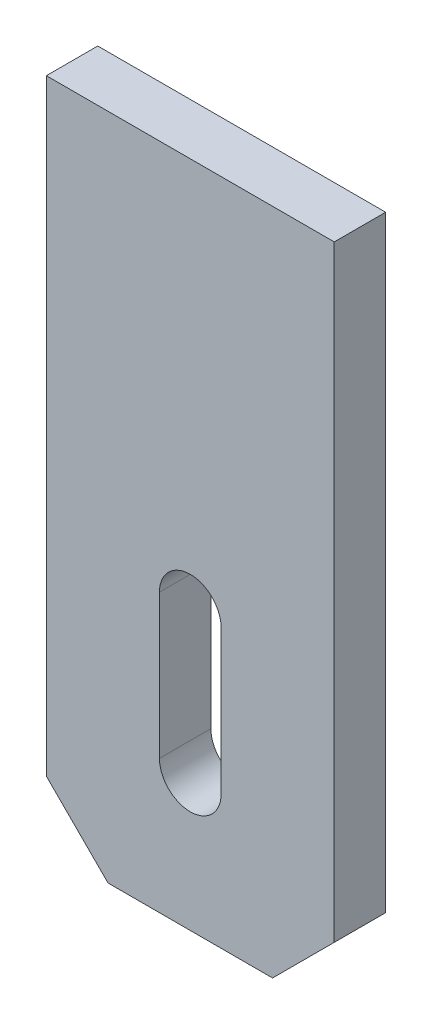
ISO-10303-21;
HEADER;
FILE_DESCRIPTION(('STEP AP214'),'2;1');
FILE_NAME('part.step','',(''),(''),'','','');
FILE_SCHEMA(('AUTOMOTIVE_DESIGN { 1 0 10303 214 1 1 1 1 }'));
ENDSEC;
DATA;
#1=APPLICATION_CONTEXT('core data for automotive mechanical design processes');
#2=APPLICATION_PROTOCOL_DEFINITION('international standard','automotive_design',2000,#1);
#3=PRODUCT_CONTEXT('',#1,'mechanical');
#4=PRODUCT('Part','Part','',(#3));
#5=PRODUCT_RELATED_PRODUCT_CATEGORY('part','',(#4));
#6=PRODUCT_DEFINITION_FORMATION('','',#4);
#7=PRODUCT_DEFINITION_CONTEXT('part definition',#1,'design');
#8=PRODUCT_DEFINITION('design','',#6,#7);
#9=PRODUCT_DEFINITION_SHAPE('','',#8);
#10=(LENGTH_UNIT() NAMED_UNIT(*) SI_UNIT(.MILLI.,.METRE.));
#11=(NAMED_UNIT(*) PLANE_ANGLE_UNIT() SI_UNIT($,.RADIAN.));
#12=(NAMED_UNIT(*) SI_UNIT($,.STERADIAN.) SOLID_ANGLE_UNIT());
#13=UNCERTAINTY_MEASURE_WITH_UNIT(LENGTH_MEASURE(1.E-05),#10,'distance_accuracy_value','');
#14=(GEOMETRIC_REPRESENTATION_CONTEXT(3) GLOBAL_UNCERTAINTY_ASSIGNED_CONTEXT((#13)) GLOBAL_UNIT_ASSIGNED_CONTEXT((#10,
#11,#12)) REPRESENTATION_CONTEXT('',''));
#15=CARTESIAN_POINT('',(0.,0.,0.));
#16=DIRECTION('',(0.,0.,1.));
#17=DIRECTION('',(1.,0.,0.));
#18=AXIS2_PLACEMENT_3D('',#15,#16,#17);
#19=CARTESIAN_POINT('',(1.4,-32.8,-0.249999999999999));
#20=DIRECTION('',(-1.,0.,0.));
#21=DIRECTION('',(0.,0.,1.));
#22=AXIS2_PLACEMENT_3D('',#19,#20,#21);
#23=PLANE('',#22);
#24=DIRECTION('',(0.,1.,0.));
#25=VECTOR('',#24,1.);
#26=CARTESIAN_POINT('',(1.4,-32.8,0.249999999999999));
#27=LINE('',#26,#25);
#28=CARTESIAN_POINT('',(1.4,-32.2,0.249999999999999));
#29=VERTEX_POINT('',#28);
#30=CARTESIAN_POINT('',(1.4,-26.3,0.249999999999999));
#31=VERTEX_POINT('',#30);
#32=EDGE_CURVE('E35',#29,#31,#27,.T.);
#33=ORIENTED_EDGE('',*,*,#32,.F.);
#34=DIRECTION('',(0.,0.,-1.));
#35=VECTOR('',#34,1.);
#36=CARTESIAN_POINT('',(1.4,-32.2,-0.249999999999999));
#37=LINE('',#36,#35);
#38=CARTESIAN_POINT('',(1.4,-32.2,-0.249999999999999));
#39=VERTEX_POINT('',#38);
#40=EDGE_CURVE('E11',#29,#39,#37,.T.);
#41=ORIENTED_EDGE('',*,*,#40,.T.);
#42=DIRECTION('',(0.,1.,0.));
#43=VECTOR('',#42,1.);
#44=CARTESIAN_POINT('',(1.4,-32.8,-0.249999999999999));
#45=LINE('',#44,#43);
#46=CARTESIAN_POINT('',(1.4,-26.3,-0.249999999999999));
#47=VERTEX_POINT('',#46);
#48=EDGE_CURVE('E27',#39,#47,#45,.T.);
#49=ORIENTED_EDGE('',*,*,#48,.T.);
#50=DIRECTION('',(0.,0.,1.));
#51=VECTOR('',#50,1.);
#52=CARTESIAN_POINT('',(1.4,-26.3,-0.249999999999999));
#53=LINE('',#52,#51);
#54=EDGE_CURVE('E157',#47,#31,#53,.T.);
#55=ORIENTED_EDGE('',*,*,#54,.T.);
#56=EDGE_LOOP('',(#33,#41,#49,#55));
#57=FACE_BOUND('',#56,.T.);
#58=ADVANCED_FACE('F17',(#57),#23,.F.);
#59=CARTESIAN_POINT('',(-1.4,-32.8,0.249999999999999));
#60=DIRECTION('',(0.,0.,-1.));
#61=DIRECTION('',(-1.,0.,0.));
#62=AXIS2_PLACEMENT_3D('',#59,#60,#61);
#63=PLANE('',#62);
#64=DIRECTION('',(0.,1.,0.));
#65=VECTOR('',#64,1.);
#66=CARTESIAN_POINT('',(0.3,-31.5,0.249999999999999));
#67=LINE('',#66,#65);
#68=CARTESIAN_POINT('',(0.3,-31.5,0.249999999999999));
#69=VERTEX_POINT('',#68);
#70=CARTESIAN_POINT('',(0.3,-30.1,0.249999999999999));
#71=VERTEX_POINT('',#70);
#72=EDGE_CURVE('E129',#69,#71,#67,.T.);
#73=ORIENTED_EDGE('',*,*,#72,.F.);
#74=CARTESIAN_POINT('',(0.,-31.5,0.249999999999999));
#75=DIRECTION('',(0.,0.,1.));
#76=DIRECTION('',(1.,0.,0.));
#77=AXIS2_PLACEMENT_3D('',#74,#75,#76);
#78=CIRCLE('',#77,0.3);
#79=CARTESIAN_POINT('',(-0.3,-31.5,0.249999999999999));
#80=VERTEX_POINT('',#79);
#81=EDGE_CURVE('E125',#80,#69,#78,.T.);
#82=ORIENTED_EDGE('',*,*,#81,.F.);
#83=DIRECTION('',(0.,-1.,0.));
#84=VECTOR('',#83,1.);
#85=CARTESIAN_POINT('',(-0.3,-31.5,0.249999999999999));
#86=LINE('',#85,#84);
#87=CARTESIAN_POINT('',(-0.3,-30.1,0.249999999999999));
#88=VERTEX_POINT('',#87);
#89=EDGE_CURVE('E133',#88,#80,#86,.T.);
#90=ORIENTED_EDGE('',*,*,#89,.F.);
#91=CARTESIAN_POINT('',(0.,-30.1,0.249999999999999));
#92=DIRECTION('',(0.,0.,1.));
#93=DIRECTION('',(1.,0.,0.));
#94=AXIS2_PLACEMENT_3D('',#91,#92,#93);
#95=CIRCLE('',#94,0.3);
#96=EDGE_CURVE('E148',#71,#88,#95,.T.);
#97=ORIENTED_EDGE('',*,*,#96,.F.);
#98=EDGE_LOOP('',(#73,#82,#90,#97));
#99=FACE_BOUND('',#98,.T.);
#100=DIRECTION('',(0.,1.,0.));
#101=VECTOR('',#100,1.);
#102=CARTESIAN_POINT('',(-1.4,-32.8,0.249999999999999));
#103=LINE('',#102,#101);
#104=CARTESIAN_POINT('',(-1.4,-32.2,0.249999999999999));
#105=VERTEX_POINT('',#104);
#106=CARTESIAN_POINT('',(-1.4,-26.3,0.249999999999999));
#107=VERTEX_POINT('',#106);
#108=EDGE_CURVE('E150',#105,#107,#103,.T.);
#109=ORIENTED_EDGE('',*,*,#108,.F.);
#110=DIRECTION('',(0.707106781186548,-0.707106781186547,0.));
#111=VECTOR('',#110,1.);
#112=CARTESIAN_POINT('',(-0.799999999999994,-32.8,0.249999999999999));
#113=LINE('',#112,#111);
#114=CARTESIAN_POINT('',(-0.799999999999994,-32.8,0.249999999999999));
#115=VERTEX_POINT('',#114);
#116=EDGE_CURVE('E154',#105,#115,#113,.T.);
#117=ORIENTED_EDGE('',*,*,#116,.T.);
#118=DIRECTION('',(-1.,0.,0.));
#119=VECTOR('',#118,1.);
#120=CARTESIAN_POINT('',(-1.4,-32.8,0.249999999999999));
#121=LINE('',#120,#119);
#122=CARTESIAN_POINT('',(0.799999999999999,-32.8,0.249999999999999));
#123=VERTEX_POINT('',#122);
#124=EDGE_CURVE('E110',#123,#115,#121,.T.);
#125=ORIENTED_EDGE('',*,*,#124,.F.);
#126=DIRECTION('',(0.707106781186547,0.707106781186548,0.));
#127=VECTOR('',#126,1.);
#128=CARTESIAN_POINT('',(0.799999999999999,-32.8,0.249999999999999));
#129=LINE('',#128,#127);
#130=EDGE_CURVE('E115',#123,#29,#129,.T.);
#131=ORIENTED_EDGE('',*,*,#130,.T.);
#132=ORIENTED_EDGE('',*,*,#32,.T.);
#133=DIRECTION('',(-1.,0.,0.));
#134=VECTOR('',#133,1.);
#135=CARTESIAN_POINT('',(-1.4,-26.3,0.249999999999999));
#136=LINE('',#135,#134);
#137=EDGE_CURVE('E160',#31,#107,#136,.T.);
#138=ORIENTED_EDGE('',*,*,#137,.T.);
#139=EDGE_LOOP('',(#109,#117,#125,#131,#132,#138));
#140=FACE_BOUND('',#139,.T.);
#141=ADVANCED_FACE('F187',(#99,#140),#63,.F.);
#142=CARTESIAN_POINT('',(-1.4,-32.8,-0.249999999999999));
#143=DIRECTION('',(1.,0.,0.));
#144=DIRECTION('',(0.,0.,-1.));
#145=AXIS2_PLACEMENT_3D('',#142,#143,#144);
#146=PLANE('',#145);
#147=DIRECTION('',(0.,1.,0.));
#148=VECTOR('',#147,1.);
#149=CARTESIAN_POINT('',(-1.4,-32.8,-0.249999999999999));
#150=LINE('',#149,#148);
#151=CARTESIAN_POINT('',(-1.4,-32.2,-0.249999999999999));
#152=VERTEX_POINT('',#151);
#153=CARTESIAN_POINT('',(-1.4,-26.3,-0.249999999999999));
#154=VERTEX_POINT('',#153);
#155=EDGE_CURVE('E163',#152,#154,#150,.T.);
#156=ORIENTED_EDGE('',*,*,#155,.F.);
#157=DIRECTION('',(0.,0.,1.));
#158=VECTOR('',#157,1.);
#159=CARTESIAN_POINT('',(-1.4,-32.2,-0.249999999999999));
#160=LINE('',#159,#158);
#161=EDGE_CURVE('E152',#152,#105,#160,.T.);
#162=ORIENTED_EDGE('',*,*,#161,.T.);
#163=ORIENTED_EDGE('',*,*,#108,.T.);
#164=DIRECTION('',(0.,0.,-1.));
#165=VECTOR('',#164,1.);
#166=CARTESIAN_POINT('',(-1.4,-26.3,-0.249999999999999));
#167=LINE('',#166,#165);
#168=EDGE_CURVE('E153',#107,#154,#167,.T.);
#169=ORIENTED_EDGE('',*,*,#168,.T.);
#170=EDGE_LOOP('',(#156,#162,#163,#169));
#171=FACE_BOUND('',#170,.T.);
#172=ADVANCED_FACE('F211',(#171),#146,.F.);
#173=CARTESIAN_POINT('',(-1.4,-32.8,-0.249999999999999));
#174=DIRECTION('',(0.,0.,1.));
#175=DIRECTION('',(1.,0.,0.));
#176=AXIS2_PLACEMENT_3D('',#173,#174,#175);
#177=PLANE('',#176);
#178=DIRECTION('',(0.,1.,0.));
#179=VECTOR('',#178,1.);
#180=CARTESIAN_POINT('',(-0.3,-31.5,-0.249999999999999));
#181=LINE('',#180,#179);
#182=CARTESIAN_POINT('',(-0.3,-31.5,-0.249999999999999));
#183=VERTEX_POINT('',#182);
#184=CARTESIAN_POINT('',(-0.3,-30.1,-0.25));
#185=VERTEX_POINT('',#184);
#186=EDGE_CURVE('E132',#183,#185,#181,.T.);
#187=ORIENTED_EDGE('',*,*,#186,.F.);
#188=CARTESIAN_POINT('',(0.,-31.5,-0.25));
#189=DIRECTION('',(0.,0.,-1.));
#190=DIRECTION('',(1.,0.,0.));
#191=AXIS2_PLACEMENT_3D('',#188,#189,#190);
#192=CIRCLE('',#191,0.3);
#193=CARTESIAN_POINT('',(0.3,-31.5,-0.249999999999999));
#194=VERTEX_POINT('',#193);
#195=EDGE_CURVE('E116',#194,#183,#192,.T.);
#196=ORIENTED_EDGE('',*,*,#195,.F.);
#197=DIRECTION('',(0.,-1.,0.));
#198=VECTOR('',#197,1.);
#199=CARTESIAN_POINT('',(0.3,-31.5,-0.249999999999999));
#200=LINE('',#199,#198);
#201=CARTESIAN_POINT('',(0.3,-30.1,-0.249999999999999));
#202=VERTEX_POINT('',#201);
#203=EDGE_CURVE('E128',#202,#194,#200,.T.);
#204=ORIENTED_EDGE('',*,*,#203,.F.);
#205=CARTESIAN_POINT('',(0.,-30.1,-0.25));
#206=DIRECTION('',(0.,0.,-1.));
#207=DIRECTION('',(1.,0.,0.));
#208=AXIS2_PLACEMENT_3D('',#205,#206,#207);
#209=CIRCLE('',#208,0.3);
#210=EDGE_CURVE('E138',#185,#202,#209,.T.);
#211=ORIENTED_EDGE('',*,*,#210,.F.);
#212=EDGE_LOOP('',(#187,#196,#204,#211));
#213=FACE_BOUND('',#212,.T.);
#214=DIRECTION('',(1.,0.,0.));
#215=VECTOR('',#214,1.);
#216=CARTESIAN_POINT('',(-1.4,-32.8,-0.249999999999999));
#217=LINE('',#216,#215);
#218=CARTESIAN_POINT('',(-0.799999999999994,-32.8,-0.249999999999999));
#219=VERTEX_POINT('',#218);
#220=CARTESIAN_POINT('',(0.799999999999999,-32.8,-0.249999999999999));
#221=VERTEX_POINT('',#220);
#222=EDGE_CURVE('E92',#219,#221,#217,.T.);
#223=ORIENTED_EDGE('',*,*,#222,.F.);
#224=DIRECTION('',(-0.707106781186548,0.707106781186547,0.));
#225=VECTOR('',#224,1.);
#226=CARTESIAN_POINT('',(-0.799999999999994,-32.8,-0.249999999999999));
#227=LINE('',#226,#225);
#228=EDGE_CURVE('E165',#219,#152,#227,.T.);
#229=ORIENTED_EDGE('',*,*,#228,.T.);
#230=ORIENTED_EDGE('',*,*,#155,.T.);
#231=DIRECTION('',(1.,0.,0.));
#232=VECTOR('',#231,1.);
#233=CARTESIAN_POINT('',(-1.4,-26.3,-0.249999999999999));
#234=LINE('',#233,#232);
#235=EDGE_CURVE('E109',#154,#47,#234,.T.);
#236=ORIENTED_EDGE('',*,*,#235,.T.);
#237=ORIENTED_EDGE('',*,*,#48,.F.);
#238=DIRECTION('',(-0.707106781186547,-0.707106781186548,0.));
#239=VECTOR('',#238,1.);
#240=CARTESIAN_POINT('',(0.799999999999999,-32.8,-0.249999999999999));
#241=LINE('',#240,#239);
#242=EDGE_CURVE('E104',#39,#221,#241,.T.);
#243=ORIENTED_EDGE('',*,*,#242,.T.);
#244=EDGE_LOOP('',(#223,#229,#230,#236,#237,#243));
#245=FACE_BOUND('',#244,.T.);
#246=ADVANCED_FACE('F105',(#213,#245),#177,.F.);
#247=CARTESIAN_POINT('',(0.,-32.8,0.));
#248=DIRECTION('',(0.,1.,0.));
#249=DIRECTION('',(0.,0.,1.));
#250=AXIS2_PLACEMENT_3D('',#247,#248,#249);
#251=PLANE('',#250);
#252=ORIENTED_EDGE('',*,*,#124,.T.);
#253=DIRECTION('',(0.,0.,-1.));
#254=VECTOR('',#253,1.);
#255=CARTESIAN_POINT('',(-0.799999999999994,-32.8,0.));
#256=LINE('',#255,#254);
#257=EDGE_CURVE('E101',#115,#219,#256,.T.);
#258=ORIENTED_EDGE('',*,*,#257,.T.);
#259=ORIENTED_EDGE('',*,*,#222,.T.);
#260=DIRECTION('',(0.,0.,1.));
#261=VECTOR('',#260,1.);
#262=CARTESIAN_POINT('',(0.799999999999999,-32.8,0.));
#263=LINE('',#262,#261);
#264=EDGE_CURVE('E99',#221,#123,#263,.T.);
#265=ORIENTED_EDGE('',*,*,#264,.T.);
#266=EDGE_LOOP('',(#252,#258,#259,#265));
#267=FACE_BOUND('',#266,.T.);
#268=ADVANCED_FACE('F97',(#267),#251,.F.);
#269=CARTESIAN_POINT('',(0.,-26.3,0.));
#270=DIRECTION('',(0.,1.,0.));
#271=DIRECTION('',(0.,0.,1.));
#272=AXIS2_PLACEMENT_3D('',#269,#270,#271);
#273=PLANE('',#272);
#274=ORIENTED_EDGE('',*,*,#54,.F.);
#275=ORIENTED_EDGE('',*,*,#235,.F.);
#276=ORIENTED_EDGE('',*,*,#168,.F.);
#277=ORIENTED_EDGE('',*,*,#137,.F.);
#278=EDGE_LOOP('',(#274,#275,#276,#277));
#279=FACE_BOUND('',#278,.T.);
#280=ADVANCED_FACE('F175',(#279),#273,.T.);
#281=CARTESIAN_POINT('',(-0.799999999999994,-32.8,0.));
#282=DIRECTION('',(0.707106781186547,0.707106781186548,0.));
#283=DIRECTION('',(0.,0.,-1.));
#284=AXIS2_PLACEMENT_3D('',#281,#282,#283);
#285=PLANE('',#284);
#286=ORIENTED_EDGE('',*,*,#116,.F.);
#287=ORIENTED_EDGE('',*,*,#161,.F.);
#288=ORIENTED_EDGE('',*,*,#228,.F.);
#289=ORIENTED_EDGE('',*,*,#257,.F.);
#290=EDGE_LOOP('',(#286,#287,#288,#289));
#291=FACE_BOUND('',#290,.T.);
#292=ADVANCED_FACE('F204',(#291),#285,.F.);
#293=CARTESIAN_POINT('',(0.799999999999999,-32.8,0.));
#294=DIRECTION('',(-0.707106781186548,0.707106781186547,0.));
#295=DIRECTION('',(0.,0.,1.));
#296=AXIS2_PLACEMENT_3D('',#293,#294,#295);
#297=PLANE('',#296);
#298=ORIENTED_EDGE('',*,*,#242,.F.);
#299=ORIENTED_EDGE('',*,*,#40,.F.);
#300=ORIENTED_EDGE('',*,*,#130,.F.);
#301=ORIENTED_EDGE('',*,*,#264,.F.);
#302=EDGE_LOOP('',(#298,#299,#300,#301));
#303=FACE_BOUND('',#302,.T.);
#304=ADVANCED_FACE('F113',(#303),#297,.F.);
#305=CARTESIAN_POINT('',(0.,-31.5,-2.33806130178211));
#306=DIRECTION('',(0.,0.,1.));
#307=DIRECTION('',(1.,0.,0.));
#308=AXIS2_PLACEMENT_3D('',#305,#306,#307);
#309=CYLINDRICAL_SURFACE('',#308,0.3);
#310=ORIENTED_EDGE('',*,*,#195,.T.);
#311=DIRECTION('',(0.,0.,1.));
#312=VECTOR('',#311,1.);
#313=CARTESIAN_POINT('',(-0.3,-31.5,-2.33806130178211));
#314=LINE('',#313,#312);
#315=EDGE_CURVE('E119',#183,#80,#314,.T.);
#316=ORIENTED_EDGE('',*,*,#315,.T.);
#317=ORIENTED_EDGE('',*,*,#81,.T.);
#318=DIRECTION('',(0.,0.,1.));
#319=VECTOR('',#318,1.);
#320=CARTESIAN_POINT('',(0.3,-31.5,-2.33806130178211));
#321=LINE('',#320,#319);
#322=EDGE_CURVE('E126',#194,#69,#321,.T.);
#323=ORIENTED_EDGE('',*,*,#322,.F.);
#324=EDGE_LOOP('',(#310,#316,#317,#323));
#325=FACE_BOUND('',#324,.T.);
#326=ADVANCED_FACE('F195',(#325),#309,.F.);
#327=CARTESIAN_POINT('',(-0.3,-31.5,-2.33806130178211));
#328=DIRECTION('',(-1.,0.,0.));
#329=DIRECTION('',(0.,-1.,0.));
#330=AXIS2_PLACEMENT_3D('',#327,#328,#329);
#331=PLANE('',#330);
#332=ORIENTED_EDGE('',*,*,#186,.T.);
#333=DIRECTION('',(0.,0.,1.));
#334=VECTOR('',#333,1.);
#335=CARTESIAN_POINT('',(-0.3,-30.1,-2.33806130178211));
#336=LINE('',#335,#334);
#337=EDGE_CURVE('E130',#185,#88,#336,.T.);
#338=ORIENTED_EDGE('',*,*,#337,.T.);
#339=ORIENTED_EDGE('',*,*,#89,.T.);
#340=ORIENTED_EDGE('',*,*,#315,.F.);
#341=EDGE_LOOP('',(#332,#338,#339,#340));
#342=FACE_BOUND('',#341,.T.);
#343=ADVANCED_FACE('F193',(#342),#331,.F.);
#344=CARTESIAN_POINT('',(0.,-30.1,-2.33806130178211));
#345=DIRECTION('',(0.,0.,1.));
#346=DIRECTION('',(1.,0.,0.));
#347=AXIS2_PLACEMENT_3D('',#344,#345,#346);
#348=CYLINDRICAL_SURFACE('',#347,0.3);
#349=ORIENTED_EDGE('',*,*,#210,.T.);
#350=DIRECTION('',(0.,0.,1.));
#351=VECTOR('',#350,1.);
#352=CARTESIAN_POINT('',(0.3,-30.1,-2.33806130178211));
#353=LINE('',#352,#351);
#354=EDGE_CURVE('E21',#202,#71,#353,.T.);
#355=ORIENTED_EDGE('',*,*,#354,.T.);
#356=ORIENTED_EDGE('',*,*,#96,.T.);
#357=ORIENTED_EDGE('',*,*,#337,.F.);
#358=EDGE_LOOP('',(#349,#355,#356,#357));
#359=FACE_BOUND('',#358,.T.);
#360=ADVANCED_FACE('F190',(#359),#348,.F.);
#361=CARTESIAN_POINT('',(0.3,-31.5,-2.33806130178211));
#362=DIRECTION('',(1.,0.,0.));
#363=DIRECTION('',(0.,1.,0.));
#364=AXIS2_PLACEMENT_3D('',#361,#362,#363);
#365=PLANE('',#364);
#366=ORIENTED_EDGE('',*,*,#203,.T.);
#367=ORIENTED_EDGE('',*,*,#322,.T.);
#368=ORIENTED_EDGE('',*,*,#72,.T.);
#369=ORIENTED_EDGE('',*,*,#354,.F.);
#370=EDGE_LOOP('',(#366,#367,#368,#369));
#371=FACE_BOUND('',#370,.T.);
#372=ADVANCED_FACE('F19',(#371),#365,.F.);
#373=CLOSED_SHELL('',(#58,#141,#172,#246,#268,#280,#292,#304,#326,#343,#360,#372));
#374=MANIFOLD_SOLID_BREP('B1',#373);
#375=ADVANCED_BREP_SHAPE_REPRESENTATION('',(#18,#374),#14);
#376=SHAPE_DEFINITION_REPRESENTATION(#9,#375);
ENDSEC;
END-ISO-10303-21;
